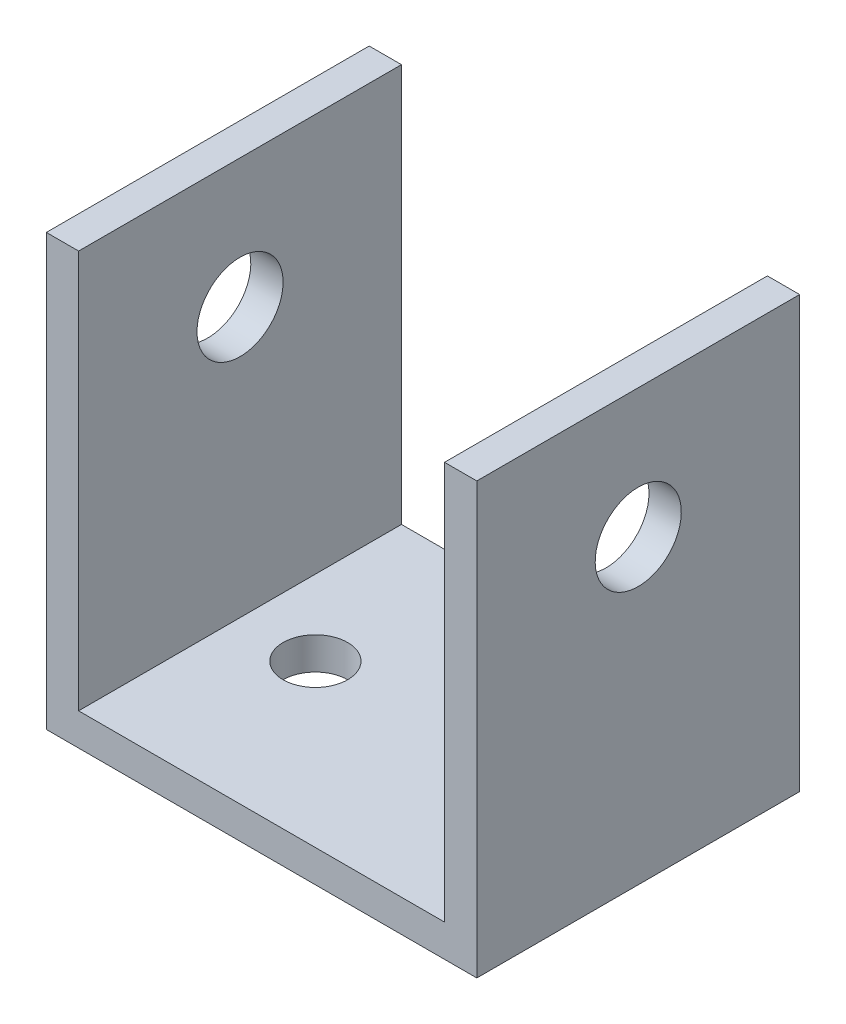
ISO-10303-21;
HEADER;
FILE_DESCRIPTION(('STEP AP214'),'2;1');
FILE_NAME('part.step','',(''),(''),'','','');
FILE_SCHEMA(('AUTOMOTIVE_DESIGN { 1 0 10303 214 1 1 1 1 }'));
ENDSEC;
DATA;
#1=APPLICATION_CONTEXT('core data for automotive mechanical design processes');
#2=APPLICATION_PROTOCOL_DEFINITION('international standard','automotive_design',2000,#1);
#3=PRODUCT_CONTEXT('',#1,'mechanical');
#4=PRODUCT('Part','Part','',(#3));
#5=PRODUCT_RELATED_PRODUCT_CATEGORY('part','',(#4));
#6=PRODUCT_DEFINITION_FORMATION('','',#4);
#7=PRODUCT_DEFINITION_CONTEXT('part definition',#1,'design');
#8=PRODUCT_DEFINITION('design','',#6,#7);
#9=PRODUCT_DEFINITION_SHAPE('','',#8);
#10=(LENGTH_UNIT() NAMED_UNIT(*) SI_UNIT(.MILLI.,.METRE.));
#11=(NAMED_UNIT(*) PLANE_ANGLE_UNIT() SI_UNIT($,.RADIAN.));
#12=(NAMED_UNIT(*) SI_UNIT($,.STERADIAN.) SOLID_ANGLE_UNIT());
#13=UNCERTAINTY_MEASURE_WITH_UNIT(LENGTH_MEASURE(1.E-05),#10,'distance_accuracy_value','');
#14=(GEOMETRIC_REPRESENTATION_CONTEXT(3) GLOBAL_UNCERTAINTY_ASSIGNED_CONTEXT((#13)) GLOBAL_UNIT_ASSIGNED_CONTEXT((#10,
#11,#12)) REPRESENTATION_CONTEXT('',''));
#15=CARTESIAN_POINT('',(0.,0.,0.));
#16=DIRECTION('',(0.,0.,1.));
#17=DIRECTION('',(1.,0.,0.));
#18=AXIS2_PLACEMENT_3D('',#15,#16,#17);
#19=CARTESIAN_POINT('',(0.,17.7265263157895,15.));
#20=DIRECTION('',(0.,-1.,0.));
#21=DIRECTION('',(0.,0.,-1.));
#22=AXIS2_PLACEMENT_3D('',#19,#20,#21);
#23=PLANE('',#22);
#24=DIRECTION('',(-1.,0.,0.));
#25=VECTOR('',#24,1.);
#26=CARTESIAN_POINT('',(0.,17.7265263157895,0.));
#27=LINE('',#26,#25);
#28=CARTESIAN_POINT('',(0.,17.7265263157895,0.));
#29=VERTEX_POINT('',#28);
#30=CARTESIAN_POINT('',(-1.5,17.7265263157895,0.));
#31=VERTEX_POINT('',#30);
#32=EDGE_CURVE('E127',#29,#31,#27,.T.);
#33=ORIENTED_EDGE('',*,*,#32,.T.);
#34=DIRECTION('',(0.,0.,-1.));
#35=VECTOR('',#34,1.);
#36=CARTESIAN_POINT('',(-1.5,17.7265263157895,15.));
#37=LINE('',#36,#35);
#38=CARTESIAN_POINT('',(-1.5,17.7265263157895,15.));
#39=VERTEX_POINT('',#38);
#40=EDGE_CURVE('E11',#39,#31,#37,.T.);
#41=ORIENTED_EDGE('',*,*,#40,.F.);
#42=DIRECTION('',(-1.,0.,0.));
#43=VECTOR('',#42,1.);
#44=CARTESIAN_POINT('',(0.,17.7265263157895,15.));
#45=LINE('',#44,#43);
#46=CARTESIAN_POINT('',(0.,17.7265263157895,15.));
#47=VERTEX_POINT('',#46);
#48=EDGE_CURVE('E142',#47,#39,#45,.T.);
#49=ORIENTED_EDGE('',*,*,#48,.F.);
#50=DIRECTION('',(0.,0.,-1.));
#51=VECTOR('',#50,1.);
#52=CARTESIAN_POINT('',(0.,17.7265263157895,15.));
#53=LINE('',#52,#51);
#54=EDGE_CURVE('E123',#47,#29,#53,.T.);
#55=ORIENTED_EDGE('',*,*,#54,.T.);
#56=EDGE_LOOP('',(#33,#41,#49,#55));
#57=FACE_BOUND('',#56,.T.);
#58=ADVANCED_FACE('F30',(#57),#23,.F.);
#59=CARTESIAN_POINT('',(-1.5,17.7265263157895,15.));
#60=DIRECTION('',(1.,0.,0.));
#61=DIRECTION('',(0.,1.,0.));
#62=AXIS2_PLACEMENT_3D('',#59,#60,#61);
#63=PLANE('',#62);
#64=CARTESIAN_POINT('',(-1.5,11.7265263157895,7.5));
#65=DIRECTION('',(1.,0.,0.));
#66=DIRECTION('',(0.,1.,0.));
#67=AXIS2_PLACEMENT_3D('',#64,#65,#66);
#68=CIRCLE('',#67,2.);
#69=CARTESIAN_POINT('',(-1.50000000000001,13.7265263157895,7.5));
#70=VERTEX_POINT('',#69);
#71=EDGE_CURVE('E181',#70,#70,#68,.T.);
#72=ORIENTED_EDGE('',*,*,#71,.T.);
#73=EDGE_LOOP('',(#72));
#74=FACE_BOUND('',#73,.T.);
#75=DIRECTION('',(0.,-1.,0.));
#76=VECTOR('',#75,1.);
#77=CARTESIAN_POINT('',(-1.5,17.7265263157895,0.));
#78=LINE('',#77,#76);
#79=CARTESIAN_POINT('',(-1.5,-2.27347368421052,0.));
#80=VERTEX_POINT('',#79);
#81=EDGE_CURVE('E130',#31,#80,#78,.T.);
#82=ORIENTED_EDGE('',*,*,#81,.T.);
#83=DIRECTION('',(0.,0.,-1.));
#84=VECTOR('',#83,1.);
#85=CARTESIAN_POINT('',(-1.5,-2.27347368421052,15.));
#86=LINE('',#85,#84);
#87=CARTESIAN_POINT('',(-1.5,-2.27347368421052,15.));
#88=VERTEX_POINT('',#87);
#89=EDGE_CURVE('E39',#88,#80,#86,.T.);
#90=ORIENTED_EDGE('',*,*,#89,.F.);
#91=DIRECTION('',(0.,-1.,0.));
#92=VECTOR('',#91,1.);
#93=CARTESIAN_POINT('',(-1.5,17.7265263157895,15.));
#94=LINE('',#93,#92);
#95=EDGE_CURVE('E90',#39,#88,#94,.T.);
#96=ORIENTED_EDGE('',*,*,#95,.F.);
#97=ORIENTED_EDGE('',*,*,#40,.T.);
#98=EDGE_LOOP('',(#82,#90,#96,#97));
#99=FACE_BOUND('',#98,.T.);
#100=ADVANCED_FACE('F214',(#74,#99),#63,.F.);
#101=CARTESIAN_POINT('',(-1.5,-2.27347368421052,15.));
#102=DIRECTION('',(0.,1.,0.));
#103=DIRECTION('',(-1.,0.,0.));
#104=AXIS2_PLACEMENT_3D('',#101,#102,#103);
#105=PLANE('',#104);
#106=CARTESIAN_POINT('',(13.5,-2.27347368421052,7.5));
#107=DIRECTION('',(0.,1.,0.));
#108=DIRECTION('',(-1.,0.,0.));
#109=AXIS2_PLACEMENT_3D('',#106,#107,#108);
#110=CIRCLE('',#109,1.5);
#111=CARTESIAN_POINT('',(12.,-2.27347368421052,7.5));
#112=VERTEX_POINT('',#111);
#113=EDGE_CURVE('E190',#112,#112,#110,.T.);
#114=ORIENTED_EDGE('',*,*,#113,.T.);
#115=EDGE_LOOP('',(#114));
#116=FACE_BOUND('',#115,.T.);
#117=CARTESIAN_POINT('',(3.5,-2.27347368421052,7.5));
#118=DIRECTION('',(0.,1.,0.));
#119=DIRECTION('',(-1.,0.,0.));
#120=AXIS2_PLACEMENT_3D('',#117,#118,#119);
#121=CIRCLE('',#120,1.5);
#122=CARTESIAN_POINT('',(2.,-2.27347368421052,7.5));
#123=VERTEX_POINT('',#122);
#124=EDGE_CURVE('E182',#123,#123,#121,.T.);
#125=ORIENTED_EDGE('',*,*,#124,.T.);
#126=EDGE_LOOP('',(#125));
#127=FACE_BOUND('',#126,.T.);
#128=DIRECTION('',(1.,0.,0.));
#129=VECTOR('',#128,1.);
#130=CARTESIAN_POINT('',(-1.5,-2.27347368421052,0.));
#131=LINE('',#130,#129);
#132=CARTESIAN_POINT('',(18.5,-2.27347368421052,0.));
#133=VERTEX_POINT('',#132);
#134=EDGE_CURVE('E133',#80,#133,#131,.T.);
#135=ORIENTED_EDGE('',*,*,#134,.T.);
#136=DIRECTION('',(0.,0.,-1.));
#137=VECTOR('',#136,1.);
#138=CARTESIAN_POINT('',(18.5,-2.27347368421052,15.));
#139=LINE('',#138,#137);
#140=CARTESIAN_POINT('',(18.5,-2.27347368421052,15.));
#141=VERTEX_POINT('',#140);
#142=EDGE_CURVE('E149',#141,#133,#139,.T.);
#143=ORIENTED_EDGE('',*,*,#142,.F.);
#144=DIRECTION('',(1.,0.,0.));
#145=VECTOR('',#144,1.);
#146=CARTESIAN_POINT('',(-1.5,-2.27347368421052,15.));
#147=LINE('',#146,#145);
#148=EDGE_CURVE('E158',#88,#141,#147,.T.);
#149=ORIENTED_EDGE('',*,*,#148,.F.);
#150=ORIENTED_EDGE('',*,*,#89,.T.);
#151=EDGE_LOOP('',(#135,#143,#149,#150));
#152=FACE_BOUND('',#151,.T.);
#153=ADVANCED_FACE('F156',(#116,#127,#152),#105,.F.);
#154=CARTESIAN_POINT('',(18.5,17.7265263157895,15.));
#155=DIRECTION('',(-1.,0.,0.));
#156=DIRECTION('',(0.,-1.,0.));
#157=AXIS2_PLACEMENT_3D('',#154,#155,#156);
#158=PLANE('',#157);
#159=CARTESIAN_POINT('',(18.5,11.7265263157895,7.5));
#160=DIRECTION('',(1.,0.,0.));
#161=DIRECTION('',(0.,1.,0.));
#162=AXIS2_PLACEMENT_3D('',#159,#160,#161);
#163=CIRCLE('',#162,2.);
#164=CARTESIAN_POINT('',(18.5,13.7265263157895,7.5));
#165=VERTEX_POINT('',#164);
#166=EDGE_CURVE('E178',#165,#165,#163,.T.);
#167=ORIENTED_EDGE('',*,*,#166,.F.);
#168=EDGE_LOOP('',(#167));
#169=FACE_BOUND('',#168,.T.);
#170=DIRECTION('',(0.,1.,0.));
#171=VECTOR('',#170,1.);
#172=CARTESIAN_POINT('',(18.5,17.7265263157895,0.));
#173=LINE('',#172,#171);
#174=CARTESIAN_POINT('',(18.5,17.7265263157895,0.));
#175=VERTEX_POINT('',#174);
#176=EDGE_CURVE('E135',#133,#175,#173,.T.);
#177=ORIENTED_EDGE('',*,*,#176,.T.);
#178=DIRECTION('',(0.,0.,-1.));
#179=VECTOR('',#178,1.);
#180=CARTESIAN_POINT('',(18.5,17.7265263157895,15.));
#181=LINE('',#180,#179);
#182=CARTESIAN_POINT('',(18.5,17.7265263157895,15.));
#183=VERTEX_POINT('',#182);
#184=EDGE_CURVE('E146',#183,#175,#181,.T.);
#185=ORIENTED_EDGE('',*,*,#184,.F.);
#186=DIRECTION('',(0.,1.,0.));
#187=VECTOR('',#186,1.);
#188=CARTESIAN_POINT('',(18.5,17.7265263157895,15.));
#189=LINE('',#188,#187);
#190=EDGE_CURVE('E170',#141,#183,#189,.T.);
#191=ORIENTED_EDGE('',*,*,#190,.F.);
#192=ORIENTED_EDGE('',*,*,#142,.T.);
#193=EDGE_LOOP('',(#177,#185,#191,#192));
#194=FACE_BOUND('',#193,.T.);
#195=ADVANCED_FACE('F166',(#169,#194),#158,.F.);
#196=CARTESIAN_POINT('',(17.,17.7265263157895,15.));
#197=DIRECTION('',(0.,-1.,0.));
#198=DIRECTION('',(0.,0.,-1.));
#199=AXIS2_PLACEMENT_3D('',#196,#197,#198);
#200=PLANE('',#199);
#201=DIRECTION('',(-1.,0.,0.));
#202=VECTOR('',#201,1.);
#203=CARTESIAN_POINT('',(17.,17.7265263157895,0.));
#204=LINE('',#203,#202);
#205=CARTESIAN_POINT('',(17.,17.7265263157895,0.));
#206=VERTEX_POINT('',#205);
#207=EDGE_CURVE('E137',#175,#206,#204,.T.);
#208=ORIENTED_EDGE('',*,*,#207,.T.);
#209=DIRECTION('',(0.,0.,-1.));
#210=VECTOR('',#209,1.);
#211=CARTESIAN_POINT('',(17.,17.7265263157895,15.));
#212=LINE('',#211,#210);
#213=CARTESIAN_POINT('',(17.,17.7265263157895,15.));
#214=VERTEX_POINT('',#213);
#215=EDGE_CURVE('E118',#214,#206,#212,.T.);
#216=ORIENTED_EDGE('',*,*,#215,.F.);
#217=DIRECTION('',(-1.,0.,0.));
#218=VECTOR('',#217,1.);
#219=CARTESIAN_POINT('',(17.,17.7265263157895,15.));
#220=LINE('',#219,#218);
#221=EDGE_CURVE('E109',#183,#214,#220,.T.);
#222=ORIENTED_EDGE('',*,*,#221,.F.);
#223=ORIENTED_EDGE('',*,*,#184,.T.);
#224=EDGE_LOOP('',(#208,#216,#222,#223));
#225=FACE_BOUND('',#224,.T.);
#226=ADVANCED_FACE('F169',(#225),#200,.F.);
#227=CARTESIAN_POINT('',(17.,-0.773473684210516,15.));
#228=DIRECTION('',(1.,0.,0.));
#229=DIRECTION('',(0.,0.,-1.));
#230=AXIS2_PLACEMENT_3D('',#227,#228,#229);
#231=PLANE('',#230);
#232=CARTESIAN_POINT('',(17.,11.7265263157895,7.5));
#233=DIRECTION('',(1.,0.,0.));
#234=DIRECTION('',(0.,0.,-1.));
#235=AXIS2_PLACEMENT_3D('',#232,#233,#234);
#236=CIRCLE('',#235,2.);
#237=CARTESIAN_POINT('',(17.,11.7265263157895,5.5));
#238=VERTEX_POINT('',#237);
#239=EDGE_CURVE('E131',#238,#238,#236,.T.);
#240=ORIENTED_EDGE('',*,*,#239,.T.);
#241=EDGE_LOOP('',(#240));
#242=FACE_BOUND('',#241,.T.);
#243=DIRECTION('',(0.,-1.,0.));
#244=VECTOR('',#243,1.);
#245=CARTESIAN_POINT('',(17.,-0.773473684210516,0.));
#246=LINE('',#245,#244);
#247=CARTESIAN_POINT('',(17.,-0.773473684210516,0.));
#248=VERTEX_POINT('',#247);
#249=EDGE_CURVE('E117',#206,#248,#246,.T.);
#250=ORIENTED_EDGE('',*,*,#249,.T.);
#251=DIRECTION('',(0.,0.,-1.));
#252=VECTOR('',#251,1.);
#253=CARTESIAN_POINT('',(17.,-0.773473684210516,15.));
#254=LINE('',#253,#252);
#255=CARTESIAN_POINT('',(17.,-0.773473684210516,15.));
#256=VERTEX_POINT('',#255);
#257=EDGE_CURVE('E114',#256,#248,#254,.T.);
#258=ORIENTED_EDGE('',*,*,#257,.F.);
#259=DIRECTION('',(0.,-1.,0.));
#260=VECTOR('',#259,1.);
#261=CARTESIAN_POINT('',(17.,-0.773473684210516,15.));
#262=LINE('',#261,#260);
#263=EDGE_CURVE('E103',#214,#256,#262,.T.);
#264=ORIENTED_EDGE('',*,*,#263,.F.);
#265=ORIENTED_EDGE('',*,*,#215,.T.);
#266=EDGE_LOOP('',(#250,#258,#264,#265));
#267=FACE_BOUND('',#266,.T.);
#268=ADVANCED_FACE('F115',(#242,#267),#231,.F.);
#269=CARTESIAN_POINT('',(0.,-0.773473684210516,15.));
#270=DIRECTION('',(0.,-1.,0.));
#271=DIRECTION('',(1.,0.,0.));
#272=AXIS2_PLACEMENT_3D('',#269,#270,#271);
#273=PLANE('',#272);
#274=CARTESIAN_POINT('',(13.5,-0.773473684210516,7.5));
#275=DIRECTION('',(0.,1.,0.));
#276=DIRECTION('',(-1.,0.,0.));
#277=AXIS2_PLACEMENT_3D('',#274,#275,#276);
#278=CIRCLE('',#277,1.5);
#279=CARTESIAN_POINT('',(12.,-0.773473684210516,7.5));
#280=VERTEX_POINT('',#279);
#281=EDGE_CURVE('E193',#280,#280,#278,.T.);
#282=ORIENTED_EDGE('',*,*,#281,.F.);
#283=EDGE_LOOP('',(#282));
#284=FACE_BOUND('',#283,.T.);
#285=CARTESIAN_POINT('',(3.5,-0.773473684210516,7.5));
#286=DIRECTION('',(0.,1.,0.));
#287=DIRECTION('',(-1.,0.,0.));
#288=AXIS2_PLACEMENT_3D('',#285,#286,#287);
#289=CIRCLE('',#288,1.5);
#290=CARTESIAN_POINT('',(2.,-0.773473684210516,7.5));
#291=VERTEX_POINT('',#290);
#292=EDGE_CURVE('E187',#291,#291,#289,.T.);
#293=ORIENTED_EDGE('',*,*,#292,.F.);
#294=EDGE_LOOP('',(#293));
#295=FACE_BOUND('',#294,.T.);
#296=DIRECTION('',(-1.,0.,0.));
#297=VECTOR('',#296,1.);
#298=CARTESIAN_POINT('',(0.,-0.773473684210516,0.));
#299=LINE('',#298,#297);
#300=CARTESIAN_POINT('',(0.,-0.773473684210516,0.));
#301=VERTEX_POINT('',#300);
#302=EDGE_CURVE('E76',#248,#301,#299,.T.);
#303=ORIENTED_EDGE('',*,*,#302,.T.);
#304=DIRECTION('',(0.,0.,-1.));
#305=VECTOR('',#304,1.);
#306=CARTESIAN_POINT('',(0.,-0.773473684210516,15.));
#307=LINE('',#306,#305);
#308=CARTESIAN_POINT('',(0.,-0.773473684210516,15.));
#309=VERTEX_POINT('',#308);
#310=EDGE_CURVE('E119',#309,#301,#307,.T.);
#311=ORIENTED_EDGE('',*,*,#310,.F.);
#312=DIRECTION('',(-1.,0.,0.));
#313=VECTOR('',#312,1.);
#314=CARTESIAN_POINT('',(0.,-0.773473684210516,15.));
#315=LINE('',#314,#313);
#316=EDGE_CURVE('E107',#256,#309,#315,.T.);
#317=ORIENTED_EDGE('',*,*,#316,.F.);
#318=ORIENTED_EDGE('',*,*,#257,.T.);
#319=EDGE_LOOP('',(#303,#311,#317,#318));
#320=FACE_BOUND('',#319,.T.);
#321=ADVANCED_FACE('F121',(#284,#295,#320),#273,.F.);
#322=CARTESIAN_POINT('',(0.,-0.773473684210516,15.));
#323=DIRECTION('',(-1.,0.,0.));
#324=DIRECTION('',(0.,0.,1.));
#325=AXIS2_PLACEMENT_3D('',#322,#323,#324);
#326=PLANE('',#325);
#327=CARTESIAN_POINT('',(0.,11.7265263157895,7.5));
#328=DIRECTION('',(-1.,0.,0.));
#329=DIRECTION('',(0.,0.,1.));
#330=AXIS2_PLACEMENT_3D('',#327,#328,#329);
#331=CIRCLE('',#330,2.);
#332=CARTESIAN_POINT('',(0.,11.7265263157895,9.5));
#333=VERTEX_POINT('',#332);
#334=EDGE_CURVE('E33',#333,#333,#331,.T.);
#335=ORIENTED_EDGE('',*,*,#334,.T.);
#336=EDGE_LOOP('',(#335));
#337=FACE_BOUND('',#336,.T.);
#338=DIRECTION('',(0.,1.,0.));
#339=VECTOR('',#338,1.);
#340=CARTESIAN_POINT('',(0.,-0.773473684210516,0.));
#341=LINE('',#340,#339);
#342=EDGE_CURVE('E82',#301,#29,#341,.T.);
#343=ORIENTED_EDGE('',*,*,#342,.T.);
#344=ORIENTED_EDGE('',*,*,#54,.F.);
#345=DIRECTION('',(0.,1.,0.));
#346=VECTOR('',#345,1.);
#347=CARTESIAN_POINT('',(0.,-0.773473684210516,15.));
#348=LINE('',#347,#346);
#349=EDGE_CURVE('E47',#309,#47,#348,.T.);
#350=ORIENTED_EDGE('',*,*,#349,.F.);
#351=ORIENTED_EDGE('',*,*,#310,.T.);
#352=EDGE_LOOP('',(#343,#344,#350,#351));
#353=FACE_BOUND('',#352,.T.);
#354=ADVANCED_FACE('F202',(#337,#353),#326,.F.);
#355=CARTESIAN_POINT('',(-1.5,17.7265263157895,15.));
#356=DIRECTION('',(0.,0.,1.));
#357=DIRECTION('',(1.,0.,0.));
#358=AXIS2_PLACEMENT_3D('',#355,#356,#357);
#359=PLANE('',#358);
#360=ORIENTED_EDGE('',*,*,#48,.T.);
#361=ORIENTED_EDGE('',*,*,#95,.T.);
#362=ORIENTED_EDGE('',*,*,#148,.T.);
#363=ORIENTED_EDGE('',*,*,#190,.T.);
#364=ORIENTED_EDGE('',*,*,#221,.T.);
#365=ORIENTED_EDGE('',*,*,#263,.T.);
#366=ORIENTED_EDGE('',*,*,#316,.T.);
#367=ORIENTED_EDGE('',*,*,#349,.T.);
#368=EDGE_LOOP('',(#360,#361,#362,#363,#364,#365,#366,#367));
#369=FACE_BOUND('',#368,.T.);
#370=ADVANCED_FACE('F105',(#369),#359,.T.);
#371=CARTESIAN_POINT('',(-1.5,17.7265263157895,0.));
#372=DIRECTION('',(0.,0.,1.));
#373=DIRECTION('',(1.,0.,0.));
#374=AXIS2_PLACEMENT_3D('',#371,#372,#373);
#375=PLANE('',#374);
#376=ORIENTED_EDGE('',*,*,#32,.F.);
#377=ORIENTED_EDGE('',*,*,#342,.F.);
#378=ORIENTED_EDGE('',*,*,#302,.F.);
#379=ORIENTED_EDGE('',*,*,#249,.F.);
#380=ORIENTED_EDGE('',*,*,#207,.F.);
#381=ORIENTED_EDGE('',*,*,#176,.F.);
#382=ORIENTED_EDGE('',*,*,#134,.F.);
#383=ORIENTED_EDGE('',*,*,#81,.F.);
#384=EDGE_LOOP('',(#376,#377,#378,#379,#380,#381,#382,#383));
#385=FACE_BOUND('',#384,.T.);
#386=ADVANCED_FACE('F162',(#385),#375,.F.);
#387=CARTESIAN_POINT('',(-1.5,11.7265263157895,7.5));
#388=DIRECTION('',(1.,0.,0.));
#389=DIRECTION('',(0.,1.,0.));
#390=AXIS2_PLACEMENT_3D('',#387,#388,#389);
#391=CYLINDRICAL_SURFACE('',#390,2.);
#392=ORIENTED_EDGE('',*,*,#71,.F.);
#393=EDGE_LOOP('',(#392));
#394=FACE_BOUND('',#393,.T.);
#395=ORIENTED_EDGE('',*,*,#334,.F.);
#396=EDGE_LOOP('',(#395));
#397=FACE_BOUND('',#396,.T.);
#398=ADVANCED_FACE('F282',(#394,#397),#391,.F.);
#399=ORIENTED_EDGE('',*,*,#166,.T.);
#400=EDGE_LOOP('',(#399));
#401=FACE_BOUND('',#400,.T.);
#402=ORIENTED_EDGE('',*,*,#239,.F.);
#403=EDGE_LOOP('',(#402));
#404=FACE_BOUND('',#403,.T.);
#405=ADVANCED_FACE('F209',(#401,#404),#391,.F.);
#406=CARTESIAN_POINT('',(3.5,-10.7734736842105,7.5));
#407=DIRECTION('',(0.,1.,0.));
#408=DIRECTION('',(-1.,0.,0.));
#409=AXIS2_PLACEMENT_3D('',#406,#407,#408);
#410=CYLINDRICAL_SURFACE('',#409,1.5);
#411=ORIENTED_EDGE('',*,*,#292,.T.);
#412=EDGE_LOOP('',(#411));
#413=FACE_BOUND('',#412,.T.);
#414=ORIENTED_EDGE('',*,*,#124,.F.);
#415=EDGE_LOOP('',(#414));
#416=FACE_BOUND('',#415,.T.);
#417=ADVANCED_FACE('F206',(#413,#416),#410,.F.);
#418=CARTESIAN_POINT('',(13.5,-10.7734736842105,7.5));
#419=DIRECTION('',(0.,1.,0.));
#420=DIRECTION('',(-1.,0.,0.));
#421=AXIS2_PLACEMENT_3D('',#418,#419,#420);
#422=CYLINDRICAL_SURFACE('',#421,1.5);
#423=ORIENTED_EDGE('',*,*,#281,.T.);
#424=EDGE_LOOP('',(#423));
#425=FACE_BOUND('',#424,.T.);
#426=ORIENTED_EDGE('',*,*,#113,.F.);
#427=EDGE_LOOP('',(#426));
#428=FACE_BOUND('',#427,.T.);
#429=ADVANCED_FACE('F197',(#425,#428),#422,.F.);
#430=CLOSED_SHELL('',(#58,#100,#153,#195,#226,#268,#321,#354,#370,#386,#398,#405,#417,#429));
#431=MANIFOLD_SOLID_BREP('B2',#430);
#432=ADVANCED_BREP_SHAPE_REPRESENTATION('',(#18,#431),#14);
#433=SHAPE_DEFINITION_REPRESENTATION(#9,#432);
ENDSEC;
END-ISO-10303-21;
